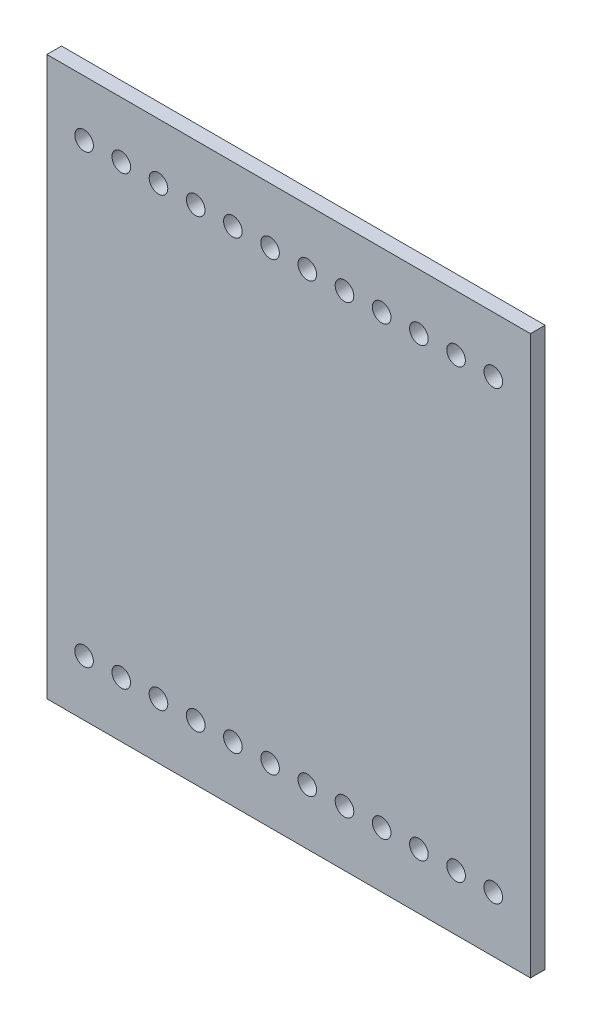
ISO-10303-21;
HEADER;
FILE_DESCRIPTION(('STEP AP214'),'2;1');
FILE_NAME('part.step','',(''),(''),'','','');
FILE_SCHEMA(('AUTOMOTIVE_DESIGN { 1 0 10303 214 1 1 1 1 }'));
ENDSEC;
DATA;
#1=APPLICATION_CONTEXT('core data for automotive mechanical design processes');
#2=APPLICATION_PROTOCOL_DEFINITION('international standard','automotive_design',2000,#1);
#3=PRODUCT_CONTEXT('',#1,'mechanical');
#4=PRODUCT('Part','Part','',(#3));
#5=PRODUCT_RELATED_PRODUCT_CATEGORY('part','',(#4));
#6=PRODUCT_DEFINITION_FORMATION('','',#4);
#7=PRODUCT_DEFINITION_CONTEXT('part definition',#1,'design');
#8=PRODUCT_DEFINITION('design','',#6,#7);
#9=PRODUCT_DEFINITION_SHAPE('','',#8);
#10=(LENGTH_UNIT() NAMED_UNIT(*) SI_UNIT(.MILLI.,.METRE.));
#11=(NAMED_UNIT(*) PLANE_ANGLE_UNIT() SI_UNIT($,.RADIAN.));
#12=(NAMED_UNIT(*) SI_UNIT($,.STERADIAN.) SOLID_ANGLE_UNIT());
#13=UNCERTAINTY_MEASURE_WITH_UNIT(LENGTH_MEASURE(1.E-05),#10,'distance_accuracy_value','');
#14=(GEOMETRIC_REPRESENTATION_CONTEXT(3) GLOBAL_UNCERTAINTY_ASSIGNED_CONTEXT((#13)) GLOBAL_UNIT_ASSIGNED_CONTEXT((#10,
#11,#12)) REPRESENTATION_CONTEXT('',''));
#15=CARTESIAN_POINT('',(0.,0.,0.));
#16=DIRECTION('',(0.,0.,1.));
#17=DIRECTION('',(1.,0.,0.));
#18=AXIS2_PLACEMENT_3D('',#15,#16,#17);
#19=CARTESIAN_POINT('',(-16.51,-19.05,1.));
#20=DIRECTION('',(1.,0.,0.));
#21=DIRECTION('',(0.,0.,-1.));
#22=AXIS2_PLACEMENT_3D('',#19,#20,#21);
#23=PLANE('',#22);
#24=DIRECTION('',(0.,-1.,0.));
#25=VECTOR('',#24,1.);
#26=CARTESIAN_POINT('',(-16.51,-19.05,0.));
#27=LINE('',#26,#25);
#28=CARTESIAN_POINT('',(-16.51,19.05,0.));
#29=VERTEX_POINT('',#28);
#30=CARTESIAN_POINT('',(-16.51,-19.05,0.));
#31=VERTEX_POINT('',#30);
#32=EDGE_CURVE('E99',#29,#31,#27,.T.);
#33=ORIENTED_EDGE('',*,*,#32,.T.);
#34=DIRECTION('',(0.,0.,-1.));
#35=VECTOR('',#34,1.);
#36=CARTESIAN_POINT('',(-16.51,-19.05,1.));
#37=LINE('',#36,#35);
#38=CARTESIAN_POINT('',(-16.51,-19.05,1.));
#39=VERTEX_POINT('',#38);
#40=EDGE_CURVE('E11',#39,#31,#37,.T.);
#41=ORIENTED_EDGE('',*,*,#40,.F.);
#42=DIRECTION('',(0.,-1.,0.));
#43=VECTOR('',#42,1.);
#44=CARTESIAN_POINT('',(-16.51,-19.05,1.));
#45=LINE('',#44,#43);
#46=CARTESIAN_POINT('',(-16.51,19.05,1.));
#47=VERTEX_POINT('',#46);
#48=EDGE_CURVE('E87',#47,#39,#45,.T.);
#49=ORIENTED_EDGE('',*,*,#48,.F.);
#50=DIRECTION('',(0.,0.,-1.));
#51=VECTOR('',#50,1.);
#52=CARTESIAN_POINT('',(-16.51,19.05,1.));
#53=LINE('',#52,#51);
#54=EDGE_CURVE('E95',#47,#29,#53,.T.);
#55=ORIENTED_EDGE('',*,*,#54,.T.);
#56=EDGE_LOOP('',(#33,#41,#49,#55));
#57=FACE_BOUND('',#56,.T.);
#58=ADVANCED_FACE('F36',(#57),#23,.F.);
#59=CARTESIAN_POINT('',(16.51,-19.05,1.));
#60=DIRECTION('',(0.,1.,0.));
#61=DIRECTION('',(-1.,0.,0.));
#62=AXIS2_PLACEMENT_3D('',#59,#60,#61);
#63=PLANE('',#62);
#64=DIRECTION('',(1.,0.,0.));
#65=VECTOR('',#64,1.);
#66=CARTESIAN_POINT('',(16.51,-19.05,0.));
#67=LINE('',#66,#65);
#68=CARTESIAN_POINT('',(16.51,-19.05,0.));
#69=VERTEX_POINT('',#68);
#70=EDGE_CURVE('E91',#31,#69,#67,.T.);
#71=ORIENTED_EDGE('',*,*,#70,.T.);
#72=DIRECTION('',(0.,0.,-1.));
#73=VECTOR('',#72,1.);
#74=CARTESIAN_POINT('',(16.51,-19.05,1.));
#75=LINE('',#74,#73);
#76=CARTESIAN_POINT('',(16.51,-19.05,1.));
#77=VERTEX_POINT('',#76);
#78=EDGE_CURVE('E44',#77,#69,#75,.T.);
#79=ORIENTED_EDGE('',*,*,#78,.F.);
#80=DIRECTION('',(1.,0.,0.));
#81=VECTOR('',#80,1.);
#82=CARTESIAN_POINT('',(16.51,-19.05,1.));
#83=LINE('',#82,#81);
#84=EDGE_CURVE('E82',#39,#77,#83,.T.);
#85=ORIENTED_EDGE('',*,*,#84,.F.);
#86=ORIENTED_EDGE('',*,*,#40,.T.);
#87=EDGE_LOOP('',(#71,#79,#85,#86));
#88=FACE_BOUND('',#87,.T.);
#89=ADVANCED_FACE('F90',(#88),#63,.F.);
#90=CARTESIAN_POINT('',(16.51,-19.05,1.));
#91=DIRECTION('',(-1.,0.,0.));
#92=DIRECTION('',(0.,0.,1.));
#93=AXIS2_PLACEMENT_3D('',#90,#91,#92);
#94=PLANE('',#93);
#95=DIRECTION('',(0.,1.,0.));
#96=VECTOR('',#95,1.);
#97=CARTESIAN_POINT('',(16.51,-19.05,0.));
#98=LINE('',#97,#96);
#99=CARTESIAN_POINT('',(16.51,19.05,0.));
#100=VERTEX_POINT('',#99);
#101=EDGE_CURVE('E69',#69,#100,#98,.T.);
#102=ORIENTED_EDGE('',*,*,#101,.T.);
#103=DIRECTION('',(0.,0.,-1.));
#104=VECTOR('',#103,1.);
#105=CARTESIAN_POINT('',(16.51,19.05,1.));
#106=LINE('',#105,#104);
#107=CARTESIAN_POINT('',(16.51,19.05,1.));
#108=VERTEX_POINT('',#107);
#109=EDGE_CURVE('E92',#108,#100,#106,.T.);
#110=ORIENTED_EDGE('',*,*,#109,.F.);
#111=DIRECTION('',(0.,1.,0.));
#112=VECTOR('',#111,1.);
#113=CARTESIAN_POINT('',(16.51,-19.05,1.));
#114=LINE('',#113,#112);
#115=EDGE_CURVE('E85',#77,#108,#114,.T.);
#116=ORIENTED_EDGE('',*,*,#115,.F.);
#117=ORIENTED_EDGE('',*,*,#78,.T.);
#118=EDGE_LOOP('',(#102,#110,#116,#117));
#119=FACE_BOUND('',#118,.T.);
#120=ADVANCED_FACE('F93',(#119),#94,.F.);
#121=CARTESIAN_POINT('',(16.51,19.05,1.));
#122=DIRECTION('',(0.,-1.,0.));
#123=DIRECTION('',(1.,0.,0.));
#124=AXIS2_PLACEMENT_3D('',#121,#122,#123);
#125=PLANE('',#124);
#126=DIRECTION('',(-1.,0.,0.));
#127=VECTOR('',#126,1.);
#128=CARTESIAN_POINT('',(16.51,19.05,0.));
#129=LINE('',#128,#127);
#130=EDGE_CURVE('E75',#100,#29,#129,.T.);
#131=ORIENTED_EDGE('',*,*,#130,.T.);
#132=ORIENTED_EDGE('',*,*,#54,.F.);
#133=DIRECTION('',(-1.,0.,0.));
#134=VECTOR('',#133,1.);
#135=CARTESIAN_POINT('',(16.51,19.05,1.));
#136=LINE('',#135,#134);
#137=EDGE_CURVE('E52',#108,#47,#136,.T.);
#138=ORIENTED_EDGE('',*,*,#137,.F.);
#139=ORIENTED_EDGE('',*,*,#109,.T.);
#140=EDGE_LOOP('',(#131,#132,#138,#139));
#141=FACE_BOUND('',#140,.T.);
#142=ADVANCED_FACE('F107',(#141),#125,.F.);
#143=CARTESIAN_POINT('',(0.,0.,1.));
#144=DIRECTION('',(0.,0.,1.));
#145=DIRECTION('',(1.,0.,0.));
#146=AXIS2_PLACEMENT_3D('',#143,#144,#145);
#147=PLANE('',#146);
#148=CARTESIAN_POINT('',(8.89000000000001,15.24,1.));
#149=DIRECTION('',(0.,0.,1.));
#150=DIRECTION('',(1.,0.,0.));
#151=AXIS2_PLACEMENT_3D('',#148,#149,#150);
#152=CIRCLE('',#151,0.635000000000001);
#153=CARTESIAN_POINT('',(9.52500000000001,15.24,1.));
#154=VERTEX_POINT('',#153);
#155=EDGE_CURVE('E186',#154,#154,#152,.T.);
#156=ORIENTED_EDGE('',*,*,#155,.F.);
#157=EDGE_LOOP('',(#156));
#158=FACE_BOUND('',#157,.T.);
#159=CARTESIAN_POINT('',(11.43,15.24,1.));
#160=DIRECTION('',(0.,0.,1.));
#161=DIRECTION('',(1.,0.,0.));
#162=AXIS2_PLACEMENT_3D('',#159,#160,#161);
#163=CIRCLE('',#162,0.635000000000001);
#164=CARTESIAN_POINT('',(12.065,15.24,1.));
#165=VERTEX_POINT('',#164);
#166=EDGE_CURVE('E180',#165,#165,#163,.T.);
#167=ORIENTED_EDGE('',*,*,#166,.F.);
#168=EDGE_LOOP('',(#167));
#169=FACE_BOUND('',#168,.T.);
#170=CARTESIAN_POINT('',(13.97,15.24,1.));
#171=DIRECTION('',(0.,0.,1.));
#172=DIRECTION('',(1.,0.,0.));
#173=AXIS2_PLACEMENT_3D('',#170,#171,#172);
#174=CIRCLE('',#173,0.635000000000001);
#175=CARTESIAN_POINT('',(14.605,15.24,1.));
#176=VERTEX_POINT('',#175);
#177=EDGE_CURVE('E174',#176,#176,#174,.T.);
#178=ORIENTED_EDGE('',*,*,#177,.F.);
#179=EDGE_LOOP('',(#178));
#180=FACE_BOUND('',#179,.T.);
#181=CARTESIAN_POINT('',(13.97,-15.24,1.));
#182=DIRECTION('',(0.,0.,1.));
#183=DIRECTION('',(-1.,0.,0.));
#184=AXIS2_PLACEMENT_3D('',#181,#182,#183);
#185=CIRCLE('',#184,0.635000000000001);
#186=CARTESIAN_POINT('',(13.335,-15.24,1.));
#187=VERTEX_POINT('',#186);
#188=EDGE_CURVE('E167',#187,#187,#185,.T.);
#189=ORIENTED_EDGE('',*,*,#188,.F.);
#190=EDGE_LOOP('',(#189));
#191=FACE_BOUND('',#190,.T.);
#192=CARTESIAN_POINT('',(11.43,-15.24,1.));
#193=DIRECTION('',(0.,0.,1.));
#194=DIRECTION('',(-1.,0.,0.));
#195=AXIS2_PLACEMENT_3D('',#192,#193,#194);
#196=CIRCLE('',#195,0.635000000000001);
#197=CARTESIAN_POINT('',(10.795,-15.24,1.));
#198=VERTEX_POINT('',#197);
#199=EDGE_CURVE('E210',#198,#198,#196,.T.);
#200=ORIENTED_EDGE('',*,*,#199,.F.);
#201=EDGE_LOOP('',(#200));
#202=FACE_BOUND('',#201,.T.);
#203=CARTESIAN_POINT('',(8.89,-15.24,1.));
#204=DIRECTION('',(0.,0.,1.));
#205=DIRECTION('',(-1.,0.,0.));
#206=AXIS2_PLACEMENT_3D('',#203,#204,#205);
#207=CIRCLE('',#206,0.635000000000001);
#208=CARTESIAN_POINT('',(8.255,-15.24,1.));
#209=VERTEX_POINT('',#208);
#210=EDGE_CURVE('E204',#209,#209,#207,.T.);
#211=ORIENTED_EDGE('',*,*,#210,.F.);
#212=EDGE_LOOP('',(#211));
#213=FACE_BOUND('',#212,.T.);
#214=CARTESIAN_POINT('',(6.35,-15.24,1.));
#215=DIRECTION('',(0.,0.,1.));
#216=DIRECTION('',(-1.,0.,0.));
#217=AXIS2_PLACEMENT_3D('',#214,#215,#216);
#218=CIRCLE('',#217,0.635000000000001);
#219=CARTESIAN_POINT('',(5.715,-15.24,1.));
#220=VERTEX_POINT('',#219);
#221=EDGE_CURVE('E198',#220,#220,#218,.T.);
#222=ORIENTED_EDGE('',*,*,#221,.F.);
#223=EDGE_LOOP('',(#222));
#224=FACE_BOUND('',#223,.T.);
#225=CARTESIAN_POINT('',(3.81,-15.24,1.));
#226=DIRECTION('',(0.,0.,1.));
#227=DIRECTION('',(-1.,0.,0.));
#228=AXIS2_PLACEMENT_3D('',#225,#226,#227);
#229=CIRCLE('',#228,0.635000000000002);
#230=CARTESIAN_POINT('',(3.175,-15.24,1.));
#231=VERTEX_POINT('',#230);
#232=EDGE_CURVE('E191',#231,#231,#229,.T.);
#233=ORIENTED_EDGE('',*,*,#232,.F.);
#234=EDGE_LOOP('',(#233));
#235=FACE_BOUND('',#234,.T.);
#236=CARTESIAN_POINT('',(6.35000000000001,15.24,1.));
#237=DIRECTION('',(0.,0.,1.));
#238=DIRECTION('',(1.,0.,0.));
#239=AXIS2_PLACEMENT_3D('',#236,#237,#238);
#240=CIRCLE('',#239,0.635000000000001);
#241=CARTESIAN_POINT('',(6.98500000000001,15.24,1.));
#242=VERTEX_POINT('',#241);
#243=EDGE_CURVE('E119',#242,#242,#240,.T.);
#244=ORIENTED_EDGE('',*,*,#243,.F.);
#245=EDGE_LOOP('',(#244));
#246=FACE_BOUND('',#245,.T.);
#247=CARTESIAN_POINT('',(3.81000000000001,15.24,1.));
#248=DIRECTION('',(0.,0.,1.));
#249=DIRECTION('',(1.,0.,0.));
#250=AXIS2_PLACEMENT_3D('',#247,#248,#249);
#251=CIRCLE('',#250,0.635000000000001);
#252=CARTESIAN_POINT('',(4.44500000000001,15.24,1.));
#253=VERTEX_POINT('',#252);
#254=EDGE_CURVE('E126',#253,#253,#251,.T.);
#255=ORIENTED_EDGE('',*,*,#254,.F.);
#256=EDGE_LOOP('',(#255));
#257=FACE_BOUND('',#256,.T.);
#258=CARTESIAN_POINT('',(1.27000000000001,15.24,1.));
#259=DIRECTION('',(0.,0.,1.));
#260=DIRECTION('',(1.,0.,0.));
#261=AXIS2_PLACEMENT_3D('',#258,#259,#260);
#262=CIRCLE('',#261,0.635000000000001);
#263=CARTESIAN_POINT('',(1.90500000000001,15.24,1.));
#264=VERTEX_POINT('',#263);
#265=EDGE_CURVE('E132',#264,#264,#262,.T.);
#266=ORIENTED_EDGE('',*,*,#265,.F.);
#267=EDGE_LOOP('',(#266));
#268=FACE_BOUND('',#267,.T.);
#269=CARTESIAN_POINT('',(-1.26999999999999,15.24,1.));
#270=DIRECTION('',(0.,0.,1.));
#271=DIRECTION('',(1.,0.,0.));
#272=AXIS2_PLACEMENT_3D('',#269,#270,#271);
#273=CIRCLE('',#272,0.635000000000001);
#274=CARTESIAN_POINT('',(-0.634999999999989,15.24,1.));
#275=VERTEX_POINT('',#274);
#276=EDGE_CURVE('E138',#275,#275,#273,.T.);
#277=ORIENTED_EDGE('',*,*,#276,.F.);
#278=EDGE_LOOP('',(#277));
#279=FACE_BOUND('',#278,.T.);
#280=CARTESIAN_POINT('',(-3.80999999999999,15.24,1.));
#281=DIRECTION('',(0.,0.,1.));
#282=DIRECTION('',(1.,0.,0.));
#283=AXIS2_PLACEMENT_3D('',#280,#281,#282);
#284=CIRCLE('',#283,0.635000000000001);
#285=CARTESIAN_POINT('',(-3.17499999999999,15.24,1.));
#286=VERTEX_POINT('',#285);
#287=EDGE_CURVE('E144',#286,#286,#284,.T.);
#288=ORIENTED_EDGE('',*,*,#287,.F.);
#289=EDGE_LOOP('',(#288));
#290=FACE_BOUND('',#289,.T.);
#291=CARTESIAN_POINT('',(-6.34999999999999,15.24,1.));
#292=DIRECTION('',(0.,0.,1.));
#293=DIRECTION('',(1.,0.,0.));
#294=AXIS2_PLACEMENT_3D('',#291,#292,#293);
#295=CIRCLE('',#294,0.635000000000001);
#296=CARTESIAN_POINT('',(-5.71499999999999,15.24,1.));
#297=VERTEX_POINT('',#296);
#298=EDGE_CURVE('E150',#297,#297,#295,.T.);
#299=ORIENTED_EDGE('',*,*,#298,.F.);
#300=EDGE_LOOP('',(#299));
#301=FACE_BOUND('',#300,.T.);
#302=CARTESIAN_POINT('',(-8.88999999999999,15.24,1.));
#303=DIRECTION('',(0.,0.,1.));
#304=DIRECTION('',(1.,0.,0.));
#305=AXIS2_PLACEMENT_3D('',#302,#303,#304);
#306=CIRCLE('',#305,0.634999999999999);
#307=CARTESIAN_POINT('',(-8.25499999999999,15.24,1.));
#308=VERTEX_POINT('',#307);
#309=EDGE_CURVE('E156',#308,#308,#306,.T.);
#310=ORIENTED_EDGE('',*,*,#309,.F.);
#311=EDGE_LOOP('',(#310));
#312=FACE_BOUND('',#311,.T.);
#313=CARTESIAN_POINT('',(-11.43,15.24,1.));
#314=DIRECTION('',(0.,0.,1.));
#315=DIRECTION('',(1.,0.,0.));
#316=AXIS2_PLACEMENT_3D('',#313,#314,#315);
#317=CIRCLE('',#316,0.635000000000001);
#318=CARTESIAN_POINT('',(-10.795,15.24,1.));
#319=VERTEX_POINT('',#318);
#320=EDGE_CURVE('E162',#319,#319,#317,.T.);
#321=ORIENTED_EDGE('',*,*,#320,.F.);
#322=EDGE_LOOP('',(#321));
#323=FACE_BOUND('',#322,.T.);
#324=CARTESIAN_POINT('',(1.27,-15.24,1.));
#325=DIRECTION('',(0.,0.,1.));
#326=DIRECTION('',(-1.,0.,0.));
#327=AXIS2_PLACEMENT_3D('',#324,#325,#326);
#328=CIRCLE('',#327,0.635000000000001);
#329=CARTESIAN_POINT('',(0.635000000000001,-15.24,1.));
#330=VERTEX_POINT('',#329);
#331=EDGE_CURVE('E251',#330,#330,#328,.T.);
#332=ORIENTED_EDGE('',*,*,#331,.F.);
#333=EDGE_LOOP('',(#332));
#334=FACE_BOUND('',#333,.T.);
#335=CARTESIAN_POINT('',(-1.27,-15.24,1.));
#336=DIRECTION('',(0.,0.,1.));
#337=DIRECTION('',(-1.,0.,0.));
#338=AXIS2_PLACEMENT_3D('',#335,#336,#337);
#339=CIRCLE('',#338,0.635000000000001);
#340=CARTESIAN_POINT('',(-1.905,-15.24,1.));
#341=VERTEX_POINT('',#340);
#342=EDGE_CURVE('E245',#341,#341,#339,.T.);
#343=ORIENTED_EDGE('',*,*,#342,.F.);
#344=EDGE_LOOP('',(#343));
#345=FACE_BOUND('',#344,.T.);
#346=CARTESIAN_POINT('',(-3.81,-15.24,1.));
#347=DIRECTION('',(0.,0.,1.));
#348=DIRECTION('',(-1.,0.,0.));
#349=AXIS2_PLACEMENT_3D('',#346,#347,#348);
#350=CIRCLE('',#349,0.635000000000001);
#351=CARTESIAN_POINT('',(-4.445,-15.24,1.));
#352=VERTEX_POINT('',#351);
#353=EDGE_CURVE('E239',#352,#352,#350,.T.);
#354=ORIENTED_EDGE('',*,*,#353,.F.);
#355=EDGE_LOOP('',(#354));
#356=FACE_BOUND('',#355,.T.);
#357=CARTESIAN_POINT('',(-6.35,-15.24,1.));
#358=DIRECTION('',(0.,0.,1.));
#359=DIRECTION('',(-1.,0.,0.));
#360=AXIS2_PLACEMENT_3D('',#357,#358,#359);
#361=CIRCLE('',#360,0.635000000000001);
#362=CARTESIAN_POINT('',(-6.985,-15.24,1.));
#363=VERTEX_POINT('',#362);
#364=EDGE_CURVE('E233',#363,#363,#361,.T.);
#365=ORIENTED_EDGE('',*,*,#364,.F.);
#366=EDGE_LOOP('',(#365));
#367=FACE_BOUND('',#366,.T.);
#368=CARTESIAN_POINT('',(-8.89,-15.24,1.));
#369=DIRECTION('',(0.,0.,1.));
#370=DIRECTION('',(-1.,0.,0.));
#371=AXIS2_PLACEMENT_3D('',#368,#369,#370);
#372=CIRCLE('',#371,0.634999999999999);
#373=CARTESIAN_POINT('',(-9.525,-15.24,1.));
#374=VERTEX_POINT('',#373);
#375=EDGE_CURVE('E227',#374,#374,#372,.T.);
#376=ORIENTED_EDGE('',*,*,#375,.F.);
#377=EDGE_LOOP('',(#376));
#378=FACE_BOUND('',#377,.T.);
#379=CARTESIAN_POINT('',(-11.43,-15.24,1.));
#380=DIRECTION('',(0.,0.,1.));
#381=DIRECTION('',(-1.,0.,0.));
#382=AXIS2_PLACEMENT_3D('',#379,#380,#381);
#383=CIRCLE('',#382,0.635000000000001);
#384=CARTESIAN_POINT('',(-12.065,-15.24,1.));
#385=VERTEX_POINT('',#384);
#386=EDGE_CURVE('E221',#385,#385,#383,.T.);
#387=ORIENTED_EDGE('',*,*,#386,.F.);
#388=EDGE_LOOP('',(#387));
#389=FACE_BOUND('',#388,.T.);
#390=CARTESIAN_POINT('',(-13.97,-15.24,1.));
#391=DIRECTION('',(0.,0.,1.));
#392=DIRECTION('',(-1.,0.,0.));
#393=AXIS2_PLACEMENT_3D('',#390,#391,#392);
#394=CIRCLE('',#393,0.634999999999999);
#395=CARTESIAN_POINT('',(-14.605,-15.24,1.));
#396=VERTEX_POINT('',#395);
#397=EDGE_CURVE('E215',#396,#396,#394,.T.);
#398=ORIENTED_EDGE('',*,*,#397,.F.);
#399=EDGE_LOOP('',(#398));
#400=FACE_BOUND('',#399,.T.);
#401=CARTESIAN_POINT('',(-13.97,15.24,1.));
#402=DIRECTION('',(0.,0.,1.));
#403=DIRECTION('',(1.,0.,0.));
#404=AXIS2_PLACEMENT_3D('',#401,#402,#403);
#405=CIRCLE('',#404,0.635000000000001);
#406=CARTESIAN_POINT('',(-13.335,15.24,1.));
#407=VERTEX_POINT('',#406);
#408=EDGE_CURVE('E113',#407,#407,#405,.T.);
#409=ORIENTED_EDGE('',*,*,#408,.F.);
#410=EDGE_LOOP('',(#409));
#411=FACE_BOUND('',#410,.T.);
#412=ORIENTED_EDGE('',*,*,#48,.T.);
#413=ORIENTED_EDGE('',*,*,#84,.T.);
#414=ORIENTED_EDGE('',*,*,#115,.T.);
#415=ORIENTED_EDGE('',*,*,#137,.T.);
#416=EDGE_LOOP('',(#412,#413,#414,#415));
#417=FACE_BOUND('',#416,.T.);
#418=ADVANCED_FACE('F83',(#158,#169,#180,#191,#202,#213,#224,#235,#246,#257,#268,#279,#290,#301,
#312,#323,#334,#345,#356,#367,#378,#389,#400,#411,#417),#147,.T.);
#419=CARTESIAN_POINT('',(0.,0.,0.));
#420=DIRECTION('',(0.,0.,1.));
#421=DIRECTION('',(1.,0.,0.));
#422=AXIS2_PLACEMENT_3D('',#419,#420,#421);
#423=PLANE('',#422);
#424=CARTESIAN_POINT('',(8.89000000000001,15.24,0.));
#425=DIRECTION('',(0.,0.,1.));
#426=DIRECTION('',(1.,0.,0.));
#427=AXIS2_PLACEMENT_3D('',#424,#425,#426);
#428=CIRCLE('',#427,0.635000000000001);
#429=CARTESIAN_POINT('',(9.52500000000001,15.24,0.));
#430=VERTEX_POINT('',#429);
#431=EDGE_CURVE('E123',#430,#430,#428,.T.);
#432=ORIENTED_EDGE('',*,*,#431,.T.);
#433=EDGE_LOOP('',(#432));
#434=FACE_BOUND('',#433,.T.);
#435=CARTESIAN_POINT('',(11.43,15.24,0.));
#436=DIRECTION('',(0.,0.,1.));
#437=DIRECTION('',(1.,0.,0.));
#438=AXIS2_PLACEMENT_3D('',#435,#436,#437);
#439=CIRCLE('',#438,0.635000000000001);
#440=CARTESIAN_POINT('',(12.065,15.24,0.));
#441=VERTEX_POINT('',#440);
#442=EDGE_CURVE('E183',#441,#441,#439,.T.);
#443=ORIENTED_EDGE('',*,*,#442,.T.);
#444=EDGE_LOOP('',(#443));
#445=FACE_BOUND('',#444,.T.);
#446=CARTESIAN_POINT('',(13.97,15.24,0.));
#447=DIRECTION('',(0.,0.,1.));
#448=DIRECTION('',(1.,0.,0.));
#449=AXIS2_PLACEMENT_3D('',#446,#447,#448);
#450=CIRCLE('',#449,0.635000000000001);
#451=CARTESIAN_POINT('',(14.605,15.24,0.));
#452=VERTEX_POINT('',#451);
#453=EDGE_CURVE('E177',#452,#452,#450,.T.);
#454=ORIENTED_EDGE('',*,*,#453,.T.);
#455=EDGE_LOOP('',(#454));
#456=FACE_BOUND('',#455,.T.);
#457=CARTESIAN_POINT('',(13.97,-15.24,0.));
#458=DIRECTION('',(0.,0.,1.));
#459=DIRECTION('',(-1.,0.,0.));
#460=AXIS2_PLACEMENT_3D('',#457,#458,#459);
#461=CIRCLE('',#460,0.635000000000001);
#462=CARTESIAN_POINT('',(13.335,-15.24,0.));
#463=VERTEX_POINT('',#462);
#464=EDGE_CURVE('E170',#463,#463,#461,.T.);
#465=ORIENTED_EDGE('',*,*,#464,.T.);
#466=EDGE_LOOP('',(#465));
#467=FACE_BOUND('',#466,.T.);
#468=CARTESIAN_POINT('',(11.43,-15.24,0.));
#469=DIRECTION('',(0.,0.,1.));
#470=DIRECTION('',(-1.,0.,0.));
#471=AXIS2_PLACEMENT_3D('',#468,#469,#470);
#472=CIRCLE('',#471,0.635000000000001);
#473=CARTESIAN_POINT('',(10.795,-15.24,0.));
#474=VERTEX_POINT('',#473);
#475=EDGE_CURVE('E171',#474,#474,#472,.T.);
#476=ORIENTED_EDGE('',*,*,#475,.T.);
#477=EDGE_LOOP('',(#476));
#478=FACE_BOUND('',#477,.T.);
#479=CARTESIAN_POINT('',(8.89,-15.24,0.));
#480=DIRECTION('',(0.,0.,1.));
#481=DIRECTION('',(-1.,0.,0.));
#482=AXIS2_PLACEMENT_3D('',#479,#480,#481);
#483=CIRCLE('',#482,0.635000000000001);
#484=CARTESIAN_POINT('',(8.255,-15.24,0.));
#485=VERTEX_POINT('',#484);
#486=EDGE_CURVE('E207',#485,#485,#483,.T.);
#487=ORIENTED_EDGE('',*,*,#486,.T.);
#488=EDGE_LOOP('',(#487));
#489=FACE_BOUND('',#488,.T.);
#490=CARTESIAN_POINT('',(6.35,-15.24,0.));
#491=DIRECTION('',(0.,0.,1.));
#492=DIRECTION('',(-1.,0.,0.));
#493=AXIS2_PLACEMENT_3D('',#490,#491,#492);
#494=CIRCLE('',#493,0.635000000000001);
#495=CARTESIAN_POINT('',(5.715,-15.24,0.));
#496=VERTEX_POINT('',#495);
#497=EDGE_CURVE('E201',#496,#496,#494,.T.);
#498=ORIENTED_EDGE('',*,*,#497,.T.);
#499=EDGE_LOOP('',(#498));
#500=FACE_BOUND('',#499,.T.);
#501=CARTESIAN_POINT('',(3.81,-15.24,0.));
#502=DIRECTION('',(0.,0.,1.));
#503=DIRECTION('',(-1.,0.,0.));
#504=AXIS2_PLACEMENT_3D('',#501,#502,#503);
#505=CIRCLE('',#504,0.635000000000002);
#506=CARTESIAN_POINT('',(3.175,-15.24,0.));
#507=VERTEX_POINT('',#506);
#508=EDGE_CURVE('E194',#507,#507,#505,.T.);
#509=ORIENTED_EDGE('',*,*,#508,.T.);
#510=EDGE_LOOP('',(#509));
#511=FACE_BOUND('',#510,.T.);
#512=CARTESIAN_POINT('',(6.35000000000001,15.24,0.));
#513=DIRECTION('',(0.,0.,1.));
#514=DIRECTION('',(1.,0.,0.));
#515=AXIS2_PLACEMENT_3D('',#512,#513,#514);
#516=CIRCLE('',#515,0.635000000000001);
#517=CARTESIAN_POINT('',(6.98500000000001,15.24,0.));
#518=VERTEX_POINT('',#517);
#519=EDGE_CURVE('E122',#518,#518,#516,.T.);
#520=ORIENTED_EDGE('',*,*,#519,.T.);
#521=EDGE_LOOP('',(#520));
#522=FACE_BOUND('',#521,.T.);
#523=CARTESIAN_POINT('',(3.81000000000001,15.24,0.));
#524=DIRECTION('',(0.,0.,1.));
#525=DIRECTION('',(1.,0.,0.));
#526=AXIS2_PLACEMENT_3D('',#523,#524,#525);
#527=CIRCLE('',#526,0.635000000000001);
#528=CARTESIAN_POINT('',(4.44500000000001,15.24,0.));
#529=VERTEX_POINT('',#528);
#530=EDGE_CURVE('E129',#529,#529,#527,.T.);
#531=ORIENTED_EDGE('',*,*,#530,.T.);
#532=EDGE_LOOP('',(#531));
#533=FACE_BOUND('',#532,.T.);
#534=CARTESIAN_POINT('',(1.27000000000001,15.24,0.));
#535=DIRECTION('',(0.,0.,1.));
#536=DIRECTION('',(1.,0.,0.));
#537=AXIS2_PLACEMENT_3D('',#534,#535,#536);
#538=CIRCLE('',#537,0.635000000000001);
#539=CARTESIAN_POINT('',(1.90500000000001,15.24,0.));
#540=VERTEX_POINT('',#539);
#541=EDGE_CURVE('E135',#540,#540,#538,.T.);
#542=ORIENTED_EDGE('',*,*,#541,.T.);
#543=EDGE_LOOP('',(#542));
#544=FACE_BOUND('',#543,.T.);
#545=CARTESIAN_POINT('',(-1.26999999999999,15.24,0.));
#546=DIRECTION('',(0.,0.,1.));
#547=DIRECTION('',(1.,0.,0.));
#548=AXIS2_PLACEMENT_3D('',#545,#546,#547);
#549=CIRCLE('',#548,0.635000000000001);
#550=CARTESIAN_POINT('',(-0.634999999999989,15.24,0.));
#551=VERTEX_POINT('',#550);
#552=EDGE_CURVE('E141',#551,#551,#549,.T.);
#553=ORIENTED_EDGE('',*,*,#552,.T.);
#554=EDGE_LOOP('',(#553));
#555=FACE_BOUND('',#554,.T.);
#556=CARTESIAN_POINT('',(-3.80999999999999,15.24,0.));
#557=DIRECTION('',(0.,0.,1.));
#558=DIRECTION('',(1.,0.,0.));
#559=AXIS2_PLACEMENT_3D('',#556,#557,#558);
#560=CIRCLE('',#559,0.635000000000001);
#561=CARTESIAN_POINT('',(-3.17499999999999,15.24,0.));
#562=VERTEX_POINT('',#561);
#563=EDGE_CURVE('E147',#562,#562,#560,.T.);
#564=ORIENTED_EDGE('',*,*,#563,.T.);
#565=EDGE_LOOP('',(#564));
#566=FACE_BOUND('',#565,.T.);
#567=CARTESIAN_POINT('',(-6.34999999999999,15.24,0.));
#568=DIRECTION('',(0.,0.,1.));
#569=DIRECTION('',(1.,0.,0.));
#570=AXIS2_PLACEMENT_3D('',#567,#568,#569);
#571=CIRCLE('',#570,0.635000000000001);
#572=CARTESIAN_POINT('',(-5.71499999999999,15.24,0.));
#573=VERTEX_POINT('',#572);
#574=EDGE_CURVE('E153',#573,#573,#571,.T.);
#575=ORIENTED_EDGE('',*,*,#574,.T.);
#576=EDGE_LOOP('',(#575));
#577=FACE_BOUND('',#576,.T.);
#578=CARTESIAN_POINT('',(-8.88999999999999,15.24,0.));
#579=DIRECTION('',(0.,0.,1.));
#580=DIRECTION('',(1.,0.,0.));
#581=AXIS2_PLACEMENT_3D('',#578,#579,#580);
#582=CIRCLE('',#581,0.634999999999999);
#583=CARTESIAN_POINT('',(-8.25499999999999,15.24,0.));
#584=VERTEX_POINT('',#583);
#585=EDGE_CURVE('E159',#584,#584,#582,.T.);
#586=ORIENTED_EDGE('',*,*,#585,.T.);
#587=EDGE_LOOP('',(#586));
#588=FACE_BOUND('',#587,.T.);
#589=CARTESIAN_POINT('',(-11.43,15.24,0.));
#590=DIRECTION('',(0.,0.,1.));
#591=DIRECTION('',(1.,0.,0.));
#592=AXIS2_PLACEMENT_3D('',#589,#590,#591);
#593=CIRCLE('',#592,0.635000000000001);
#594=CARTESIAN_POINT('',(-10.795,15.24,0.));
#595=VERTEX_POINT('',#594);
#596=EDGE_CURVE('E116',#595,#595,#593,.T.);
#597=ORIENTED_EDGE('',*,*,#596,.T.);
#598=EDGE_LOOP('',(#597));
#599=FACE_BOUND('',#598,.T.);
#600=CARTESIAN_POINT('',(1.27,-15.24,0.));
#601=DIRECTION('',(0.,0.,1.));
#602=DIRECTION('',(-1.,0.,0.));
#603=AXIS2_PLACEMENT_3D('',#600,#601,#602);
#604=CIRCLE('',#603,0.635000000000001);
#605=CARTESIAN_POINT('',(0.635000000000001,-15.24,0.));
#606=VERTEX_POINT('',#605);
#607=EDGE_CURVE('E195',#606,#606,#604,.T.);
#608=ORIENTED_EDGE('',*,*,#607,.T.);
#609=EDGE_LOOP('',(#608));
#610=FACE_BOUND('',#609,.T.);
#611=CARTESIAN_POINT('',(-1.27,-15.24,0.));
#612=DIRECTION('',(0.,0.,1.));
#613=DIRECTION('',(-1.,0.,0.));
#614=AXIS2_PLACEMENT_3D('',#611,#612,#613);
#615=CIRCLE('',#614,0.635000000000001);
#616=CARTESIAN_POINT('',(-1.905,-15.24,0.));
#617=VERTEX_POINT('',#616);
#618=EDGE_CURVE('E248',#617,#617,#615,.T.);
#619=ORIENTED_EDGE('',*,*,#618,.T.);
#620=EDGE_LOOP('',(#619));
#621=FACE_BOUND('',#620,.T.);
#622=CARTESIAN_POINT('',(-3.81,-15.24,0.));
#623=DIRECTION('',(0.,0.,1.));
#624=DIRECTION('',(-1.,0.,0.));
#625=AXIS2_PLACEMENT_3D('',#622,#623,#624);
#626=CIRCLE('',#625,0.635000000000001);
#627=CARTESIAN_POINT('',(-4.445,-15.24,0.));
#628=VERTEX_POINT('',#627);
#629=EDGE_CURVE('E242',#628,#628,#626,.T.);
#630=ORIENTED_EDGE('',*,*,#629,.T.);
#631=EDGE_LOOP('',(#630));
#632=FACE_BOUND('',#631,.T.);
#633=CARTESIAN_POINT('',(-6.35,-15.24,0.));
#634=DIRECTION('',(0.,0.,1.));
#635=DIRECTION('',(-1.,0.,0.));
#636=AXIS2_PLACEMENT_3D('',#633,#634,#635);
#637=CIRCLE('',#636,0.635000000000001);
#638=CARTESIAN_POINT('',(-6.985,-15.24,0.));
#639=VERTEX_POINT('',#638);
#640=EDGE_CURVE('E236',#639,#639,#637,.T.);
#641=ORIENTED_EDGE('',*,*,#640,.T.);
#642=EDGE_LOOP('',(#641));
#643=FACE_BOUND('',#642,.T.);
#644=CARTESIAN_POINT('',(-8.89,-15.24,0.));
#645=DIRECTION('',(0.,0.,1.));
#646=DIRECTION('',(-1.,0.,0.));
#647=AXIS2_PLACEMENT_3D('',#644,#645,#646);
#648=CIRCLE('',#647,0.634999999999999);
#649=CARTESIAN_POINT('',(-9.525,-15.24,0.));
#650=VERTEX_POINT('',#649);
#651=EDGE_CURVE('E230',#650,#650,#648,.T.);
#652=ORIENTED_EDGE('',*,*,#651,.T.);
#653=EDGE_LOOP('',(#652));
#654=FACE_BOUND('',#653,.T.);
#655=CARTESIAN_POINT('',(-11.43,-15.24,0.));
#656=DIRECTION('',(0.,0.,1.));
#657=DIRECTION('',(-1.,0.,0.));
#658=AXIS2_PLACEMENT_3D('',#655,#656,#657);
#659=CIRCLE('',#658,0.635000000000001);
#660=CARTESIAN_POINT('',(-12.065,-15.24,0.));
#661=VERTEX_POINT('',#660);
#662=EDGE_CURVE('E224',#661,#661,#659,.T.);
#663=ORIENTED_EDGE('',*,*,#662,.T.);
#664=EDGE_LOOP('',(#663));
#665=FACE_BOUND('',#664,.T.);
#666=CARTESIAN_POINT('',(-13.97,-15.24,0.));
#667=DIRECTION('',(0.,0.,1.));
#668=DIRECTION('',(-1.,0.,0.));
#669=AXIS2_PLACEMENT_3D('',#666,#667,#668);
#670=CIRCLE('',#669,0.634999999999999);
#671=CARTESIAN_POINT('',(-14.605,-15.24,0.));
#672=VERTEX_POINT('',#671);
#673=EDGE_CURVE('E218',#672,#672,#670,.T.);
#674=ORIENTED_EDGE('',*,*,#673,.T.);
#675=EDGE_LOOP('',(#674));
#676=FACE_BOUND('',#675,.T.);
#677=CARTESIAN_POINT('',(-13.97,15.24,0.));
#678=DIRECTION('',(0.,0.,1.));
#679=DIRECTION('',(1.,0.,0.));
#680=AXIS2_PLACEMENT_3D('',#677,#678,#679);
#681=CIRCLE('',#680,0.635000000000001);
#682=CARTESIAN_POINT('',(-13.335,15.24,0.));
#683=VERTEX_POINT('',#682);
#684=EDGE_CURVE('E102',#683,#683,#681,.T.);
#685=ORIENTED_EDGE('',*,*,#684,.T.);
#686=EDGE_LOOP('',(#685));
#687=FACE_BOUND('',#686,.T.);
#688=ORIENTED_EDGE('',*,*,#32,.F.);
#689=ORIENTED_EDGE('',*,*,#130,.F.);
#690=ORIENTED_EDGE('',*,*,#101,.F.);
#691=ORIENTED_EDGE('',*,*,#70,.F.);
#692=EDGE_LOOP('',(#688,#689,#690,#691));
#693=FACE_BOUND('',#692,.T.);
#694=ADVANCED_FACE('F110',(#434,#445,#456,#467,#478,#489,#500,#511,#522,#533,#544,#555,#566,
#577,#588,#599,#610,#621,#632,#643,#654,#665,#676,#687,#693),#423,.F.);
#695=CARTESIAN_POINT('',(-13.97,15.24,0.));
#696=DIRECTION('',(0.,0.,1.));
#697=DIRECTION('',(1.,0.,0.));
#698=AXIS2_PLACEMENT_3D('',#695,#696,#697);
#699=CYLINDRICAL_SURFACE('',#698,0.635000000000001);
#700=ORIENTED_EDGE('',*,*,#684,.F.);
#701=EDGE_LOOP('',(#700));
#702=FACE_BOUND('',#701,.T.);
#703=ORIENTED_EDGE('',*,*,#408,.T.);
#704=EDGE_LOOP('',(#703));
#705=FACE_BOUND('',#704,.T.);
#706=ADVANCED_FACE('F285',(#702,#705),#699,.F.);
#707=CARTESIAN_POINT('',(-13.97,-15.24,0.));
#708=DIRECTION('',(0.,0.,1.));
#709=DIRECTION('',(1.,0.,0.));
#710=AXIS2_PLACEMENT_3D('',#707,#708,#709);
#711=CYLINDRICAL_SURFACE('',#710,0.634999999999999);
#712=ORIENTED_EDGE('',*,*,#673,.F.);
#713=EDGE_LOOP('',(#712));
#714=FACE_BOUND('',#713,.T.);
#715=ORIENTED_EDGE('',*,*,#397,.T.);
#716=EDGE_LOOP('',(#715));
#717=FACE_BOUND('',#716,.T.);
#718=ADVANCED_FACE('F287',(#714,#717),#711,.F.);
#719=CARTESIAN_POINT('',(-11.43,-15.24,0.));
#720=DIRECTION('',(0.,0.,1.));
#721=DIRECTION('',(1.,0.,0.));
#722=AXIS2_PLACEMENT_3D('',#719,#720,#721);
#723=CYLINDRICAL_SURFACE('',#722,0.635000000000001);
#724=ORIENTED_EDGE('',*,*,#662,.F.);
#725=EDGE_LOOP('',(#724));
#726=FACE_BOUND('',#725,.T.);
#727=ORIENTED_EDGE('',*,*,#386,.T.);
#728=EDGE_LOOP('',(#727));
#729=FACE_BOUND('',#728,.T.);
#730=ADVANCED_FACE('F294',(#726,#729),#723,.F.);
#731=CARTESIAN_POINT('',(-8.89,-15.24,0.));
#732=DIRECTION('',(0.,0.,1.));
#733=DIRECTION('',(1.,0.,0.));
#734=AXIS2_PLACEMENT_3D('',#731,#732,#733);
#735=CYLINDRICAL_SURFACE('',#734,0.634999999999999);
#736=ORIENTED_EDGE('',*,*,#651,.F.);
#737=EDGE_LOOP('',(#736));
#738=FACE_BOUND('',#737,.T.);
#739=ORIENTED_EDGE('',*,*,#375,.T.);
#740=EDGE_LOOP('',(#739));
#741=FACE_BOUND('',#740,.T.);
#742=ADVANCED_FACE('F342',(#738,#741),#735,.F.);
#743=CARTESIAN_POINT('',(-6.35,-15.24,0.));
#744=DIRECTION('',(0.,0.,1.));
#745=DIRECTION('',(1.,0.,0.));
#746=AXIS2_PLACEMENT_3D('',#743,#744,#745);
#747=CYLINDRICAL_SURFACE('',#746,0.635000000000001);
#748=ORIENTED_EDGE('',*,*,#640,.F.);
#749=EDGE_LOOP('',(#748));
#750=FACE_BOUND('',#749,.T.);
#751=ORIENTED_EDGE('',*,*,#364,.T.);
#752=EDGE_LOOP('',(#751));
#753=FACE_BOUND('',#752,.T.);
#754=ADVANCED_FACE('F352',(#750,#753),#747,.F.);
#755=CARTESIAN_POINT('',(-3.81,-15.24,0.));
#756=DIRECTION('',(0.,0.,1.));
#757=DIRECTION('',(1.,0.,0.));
#758=AXIS2_PLACEMENT_3D('',#755,#756,#757);
#759=CYLINDRICAL_SURFACE('',#758,0.635000000000001);
#760=ORIENTED_EDGE('',*,*,#629,.F.);
#761=EDGE_LOOP('',(#760));
#762=FACE_BOUND('',#761,.T.);
#763=ORIENTED_EDGE('',*,*,#353,.T.);
#764=EDGE_LOOP('',(#763));
#765=FACE_BOUND('',#764,.T.);
#766=ADVANCED_FACE('F362',(#762,#765),#759,.F.);
#767=CARTESIAN_POINT('',(-1.27,-15.24,0.));
#768=DIRECTION('',(0.,0.,1.));
#769=DIRECTION('',(1.,0.,0.));
#770=AXIS2_PLACEMENT_3D('',#767,#768,#769);
#771=CYLINDRICAL_SURFACE('',#770,0.635000000000001);
#772=ORIENTED_EDGE('',*,*,#618,.F.);
#773=EDGE_LOOP('',(#772));
#774=FACE_BOUND('',#773,.T.);
#775=ORIENTED_EDGE('',*,*,#342,.T.);
#776=EDGE_LOOP('',(#775));
#777=FACE_BOUND('',#776,.T.);
#778=ADVANCED_FACE('F263',(#774,#777),#771,.F.);
#779=CARTESIAN_POINT('',(1.27,-15.24,0.));
#780=DIRECTION('',(0.,0.,1.));
#781=DIRECTION('',(1.,0.,0.));
#782=AXIS2_PLACEMENT_3D('',#779,#780,#781);
#783=CYLINDRICAL_SURFACE('',#782,0.635000000000001);
#784=ORIENTED_EDGE('',*,*,#607,.F.);
#785=EDGE_LOOP('',(#784));
#786=FACE_BOUND('',#785,.T.);
#787=ORIENTED_EDGE('',*,*,#331,.T.);
#788=EDGE_LOOP('',(#787));
#789=FACE_BOUND('',#788,.T.);
#790=ADVANCED_FACE('F259',(#786,#789),#783,.F.);
#791=CARTESIAN_POINT('',(-11.43,15.24,0.));
#792=DIRECTION('',(0.,0.,1.));
#793=DIRECTION('',(1.,0.,0.));
#794=AXIS2_PLACEMENT_3D('',#791,#792,#793);
#795=CYLINDRICAL_SURFACE('',#794,0.635000000000001);
#796=ORIENTED_EDGE('',*,*,#596,.F.);
#797=EDGE_LOOP('',(#796));
#798=FACE_BOUND('',#797,.T.);
#799=ORIENTED_EDGE('',*,*,#320,.T.);
#800=EDGE_LOOP('',(#799));
#801=FACE_BOUND('',#800,.T.);
#802=ADVANCED_FACE('F262',(#798,#801),#795,.F.);
#803=CARTESIAN_POINT('',(-8.88999999999999,15.24,0.));
#804=DIRECTION('',(0.,0.,1.));
#805=DIRECTION('',(1.,0.,0.));
#806=AXIS2_PLACEMENT_3D('',#803,#804,#805);
#807=CYLINDRICAL_SURFACE('',#806,0.634999999999999);
#808=ORIENTED_EDGE('',*,*,#585,.F.);
#809=EDGE_LOOP('',(#808));
#810=FACE_BOUND('',#809,.T.);
#811=ORIENTED_EDGE('',*,*,#309,.T.);
#812=EDGE_LOOP('',(#811));
#813=FACE_BOUND('',#812,.T.);
#814=ADVANCED_FACE('F396',(#810,#813),#807,.F.);
#815=CARTESIAN_POINT('',(-6.34999999999999,15.24,0.));
#816=DIRECTION('',(0.,0.,1.));
#817=DIRECTION('',(1.,0.,0.));
#818=AXIS2_PLACEMENT_3D('',#815,#816,#817);
#819=CYLINDRICAL_SURFACE('',#818,0.635000000000001);
#820=ORIENTED_EDGE('',*,*,#574,.F.);
#821=EDGE_LOOP('',(#820));
#822=FACE_BOUND('',#821,.T.);
#823=ORIENTED_EDGE('',*,*,#298,.T.);
#824=EDGE_LOOP('',(#823));
#825=FACE_BOUND('',#824,.T.);
#826=ADVANCED_FACE('F406',(#822,#825),#819,.F.);
#827=CARTESIAN_POINT('',(-3.80999999999999,15.24,0.));
#828=DIRECTION('',(0.,0.,1.));
#829=DIRECTION('',(1.,0.,0.));
#830=AXIS2_PLACEMENT_3D('',#827,#828,#829);
#831=CYLINDRICAL_SURFACE('',#830,0.635000000000001);
#832=ORIENTED_EDGE('',*,*,#563,.F.);
#833=EDGE_LOOP('',(#832));
#834=FACE_BOUND('',#833,.T.);
#835=ORIENTED_EDGE('',*,*,#287,.T.);
#836=EDGE_LOOP('',(#835));
#837=FACE_BOUND('',#836,.T.);
#838=ADVANCED_FACE('F416',(#834,#837),#831,.F.);
#839=CARTESIAN_POINT('',(-1.26999999999999,15.24,0.));
#840=DIRECTION('',(0.,0.,1.));
#841=DIRECTION('',(1.,0.,0.));
#842=AXIS2_PLACEMENT_3D('',#839,#840,#841);
#843=CYLINDRICAL_SURFACE('',#842,0.635000000000001);
#844=ORIENTED_EDGE('',*,*,#552,.F.);
#845=EDGE_LOOP('',(#844));
#846=FACE_BOUND('',#845,.T.);
#847=ORIENTED_EDGE('',*,*,#276,.T.);
#848=EDGE_LOOP('',(#847));
#849=FACE_BOUND('',#848,.T.);
#850=ADVANCED_FACE('F426',(#846,#849),#843,.F.);
#851=CARTESIAN_POINT('',(1.27000000000001,15.24,0.));
#852=DIRECTION('',(0.,0.,1.));
#853=DIRECTION('',(1.,0.,0.));
#854=AXIS2_PLACEMENT_3D('',#851,#852,#853);
#855=CYLINDRICAL_SURFACE('',#854,0.635000000000001);
#856=ORIENTED_EDGE('',*,*,#541,.F.);
#857=EDGE_LOOP('',(#856));
#858=FACE_BOUND('',#857,.T.);
#859=ORIENTED_EDGE('',*,*,#265,.T.);
#860=EDGE_LOOP('',(#859));
#861=FACE_BOUND('',#860,.T.);
#862=ADVANCED_FACE('F436',(#858,#861),#855,.F.);
#863=CARTESIAN_POINT('',(3.81000000000001,15.24,0.));
#864=DIRECTION('',(0.,0.,1.));
#865=DIRECTION('',(1.,0.,0.));
#866=AXIS2_PLACEMENT_3D('',#863,#864,#865);
#867=CYLINDRICAL_SURFACE('',#866,0.635000000000001);
#868=ORIENTED_EDGE('',*,*,#530,.F.);
#869=EDGE_LOOP('',(#868));
#870=FACE_BOUND('',#869,.T.);
#871=ORIENTED_EDGE('',*,*,#254,.T.);
#872=EDGE_LOOP('',(#871));
#873=FACE_BOUND('',#872,.T.);
#874=ADVANCED_FACE('F446',(#870,#873),#867,.F.);
#875=CARTESIAN_POINT('',(6.35000000000001,15.24,0.));
#876=DIRECTION('',(0.,0.,1.));
#877=DIRECTION('',(1.,0.,0.));
#878=AXIS2_PLACEMENT_3D('',#875,#876,#877);
#879=CYLINDRICAL_SURFACE('',#878,0.635000000000001);
#880=ORIENTED_EDGE('',*,*,#519,.F.);
#881=EDGE_LOOP('',(#880));
#882=FACE_BOUND('',#881,.T.);
#883=ORIENTED_EDGE('',*,*,#243,.T.);
#884=EDGE_LOOP('',(#883));
#885=FACE_BOUND('',#884,.T.);
#886=ADVANCED_FACE('F456',(#882,#885),#879,.F.);
#887=CARTESIAN_POINT('',(3.81,-15.24,0.));
#888=DIRECTION('',(0.,0.,1.));
#889=DIRECTION('',(1.,0.,0.));
#890=AXIS2_PLACEMENT_3D('',#887,#888,#889);
#891=CYLINDRICAL_SURFACE('',#890,0.635000000000002);
#892=ORIENTED_EDGE('',*,*,#508,.F.);
#893=EDGE_LOOP('',(#892));
#894=FACE_BOUND('',#893,.T.);
#895=ORIENTED_EDGE('',*,*,#232,.T.);
#896=EDGE_LOOP('',(#895));
#897=FACE_BOUND('',#896,.T.);
#898=ADVANCED_FACE('F466',(#894,#897),#891,.F.);
#899=CARTESIAN_POINT('',(6.35,-15.24,0.));
#900=DIRECTION('',(0.,0.,1.));
#901=DIRECTION('',(1.,0.,0.));
#902=AXIS2_PLACEMENT_3D('',#899,#900,#901);
#903=CYLINDRICAL_SURFACE('',#902,0.635000000000001);
#904=ORIENTED_EDGE('',*,*,#497,.F.);
#905=EDGE_LOOP('',(#904));
#906=FACE_BOUND('',#905,.T.);
#907=ORIENTED_EDGE('',*,*,#221,.T.);
#908=EDGE_LOOP('',(#907));
#909=FACE_BOUND('',#908,.T.);
#910=ADVANCED_FACE('F475',(#906,#909),#903,.F.);
#911=CARTESIAN_POINT('',(8.89,-15.24,0.));
#912=DIRECTION('',(0.,0.,1.));
#913=DIRECTION('',(1.,0.,0.));
#914=AXIS2_PLACEMENT_3D('',#911,#912,#913);
#915=CYLINDRICAL_SURFACE('',#914,0.635000000000001);
#916=ORIENTED_EDGE('',*,*,#486,.F.);
#917=EDGE_LOOP('',(#916));
#918=FACE_BOUND('',#917,.T.);
#919=ORIENTED_EDGE('',*,*,#210,.T.);
#920=EDGE_LOOP('',(#919));
#921=FACE_BOUND('',#920,.T.);
#922=ADVANCED_FACE('F485',(#918,#921),#915,.F.);
#923=CARTESIAN_POINT('',(11.43,-15.24,0.));
#924=DIRECTION('',(0.,0.,1.));
#925=DIRECTION('',(1.,0.,0.));
#926=AXIS2_PLACEMENT_3D('',#923,#924,#925);
#927=CYLINDRICAL_SURFACE('',#926,0.635000000000001);
#928=ORIENTED_EDGE('',*,*,#475,.F.);
#929=EDGE_LOOP('',(#928));
#930=FACE_BOUND('',#929,.T.);
#931=ORIENTED_EDGE('',*,*,#199,.T.);
#932=EDGE_LOOP('',(#931));
#933=FACE_BOUND('',#932,.T.);
#934=ADVANCED_FACE('F495',(#930,#933),#927,.F.);
#935=CARTESIAN_POINT('',(13.97,-15.24,0.));
#936=DIRECTION('',(0.,0.,1.));
#937=DIRECTION('',(1.,0.,0.));
#938=AXIS2_PLACEMENT_3D('',#935,#936,#937);
#939=CYLINDRICAL_SURFACE('',#938,0.635000000000001);
#940=ORIENTED_EDGE('',*,*,#464,.F.);
#941=EDGE_LOOP('',(#940));
#942=FACE_BOUND('',#941,.T.);
#943=ORIENTED_EDGE('',*,*,#188,.T.);
#944=EDGE_LOOP('',(#943));
#945=FACE_BOUND('',#944,.T.);
#946=ADVANCED_FACE('F505',(#942,#945),#939,.F.);
#947=CARTESIAN_POINT('',(13.97,15.24,0.));
#948=DIRECTION('',(0.,0.,1.));
#949=DIRECTION('',(1.,0.,0.));
#950=AXIS2_PLACEMENT_3D('',#947,#948,#949);
#951=CYLINDRICAL_SURFACE('',#950,0.635000000000001);
#952=ORIENTED_EDGE('',*,*,#453,.F.);
#953=EDGE_LOOP('',(#952));
#954=FACE_BOUND('',#953,.T.);
#955=ORIENTED_EDGE('',*,*,#177,.T.);
#956=EDGE_LOOP('',(#955));
#957=FACE_BOUND('',#956,.T.);
#958=ADVANCED_FACE('F515',(#954,#957),#951,.F.);
#959=CARTESIAN_POINT('',(11.43,15.24,0.));
#960=DIRECTION('',(0.,0.,1.));
#961=DIRECTION('',(1.,0.,0.));
#962=AXIS2_PLACEMENT_3D('',#959,#960,#961);
#963=CYLINDRICAL_SURFACE('',#962,0.635000000000001);
#964=ORIENTED_EDGE('',*,*,#442,.F.);
#965=EDGE_LOOP('',(#964));
#966=FACE_BOUND('',#965,.T.);
#967=ORIENTED_EDGE('',*,*,#166,.T.);
#968=EDGE_LOOP('',(#967));
#969=FACE_BOUND('',#968,.T.);
#970=ADVANCED_FACE('F525',(#966,#969),#963,.F.);
#971=CARTESIAN_POINT('',(8.89000000000001,15.24,0.));
#972=DIRECTION('',(0.,0.,1.));
#973=DIRECTION('',(1.,0.,0.));
#974=AXIS2_PLACEMENT_3D('',#971,#972,#973);
#975=CYLINDRICAL_SURFACE('',#974,0.635000000000001);
#976=ORIENTED_EDGE('',*,*,#431,.F.);
#977=EDGE_LOOP('',(#976));
#978=FACE_BOUND('',#977,.T.);
#979=ORIENTED_EDGE('',*,*,#155,.T.);
#980=EDGE_LOOP('',(#979));
#981=FACE_BOUND('',#980,.T.);
#982=ADVANCED_FACE('F535',(#978,#981),#975,.F.);
#983=CLOSED_SHELL('',(#58,#89,#120,#142,#418,#694,#706,#718,#730,#742,#754,#766,#778,#790,#802,
#814,#826,#838,#850,#862,#874,#886,#898,#910,#922,#934,#946,#958,#970,#982));
#984=MANIFOLD_SOLID_BREP('B2',#983);
#985=ADVANCED_BREP_SHAPE_REPRESENTATION('',(#18,#984),#14);
#986=SHAPE_DEFINITION_REPRESENTATION(#9,#985);
ENDSEC;
END-ISO-10303-21;
